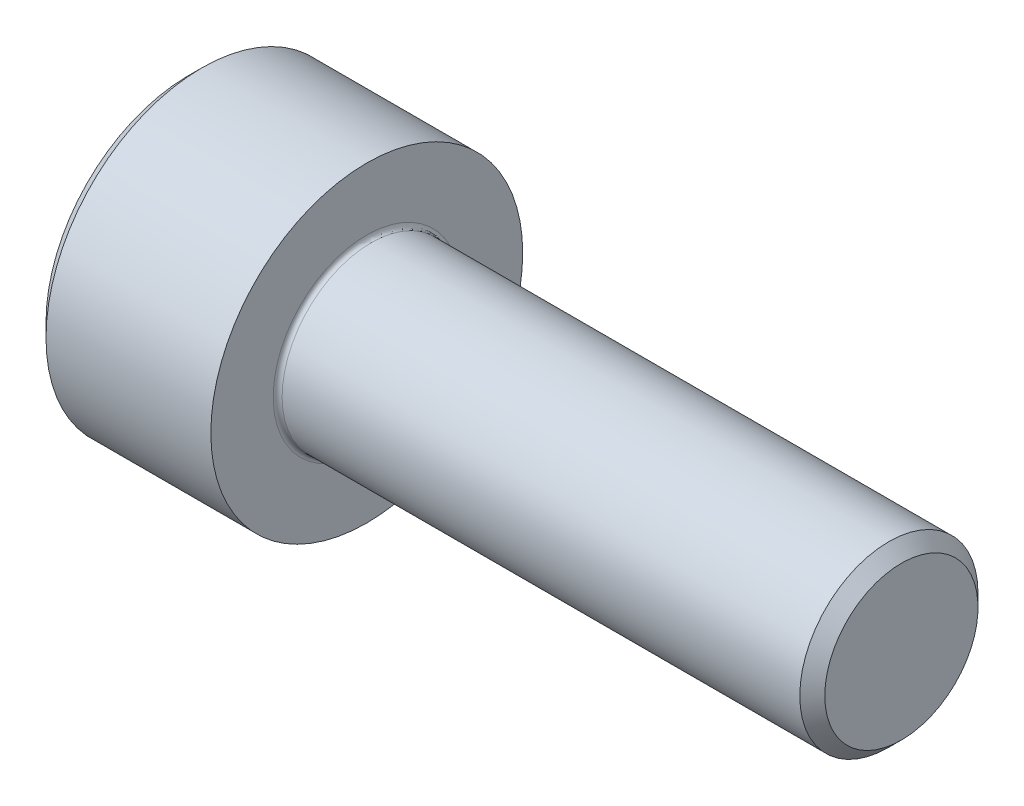
ISO-10303-21;
HEADER;
FILE_DESCRIPTION(('STEP AP214'),'2;1');
FILE_NAME('part.step','',(''),(''),'','','');
FILE_SCHEMA(('AUTOMOTIVE_DESIGN { 1 0 10303 214 1 1 1 1 }'));
ENDSEC;
DATA;
#1=APPLICATION_CONTEXT('core data for automotive mechanical design processes');
#2=APPLICATION_PROTOCOL_DEFINITION('international standard','automotive_design',2000,#1);
#3=PRODUCT_CONTEXT('',#1,'mechanical');
#4=PRODUCT('Part','Part','',(#3));
#5=PRODUCT_RELATED_PRODUCT_CATEGORY('part','',(#4));
#6=PRODUCT_DEFINITION_FORMATION('','',#4);
#7=PRODUCT_DEFINITION_CONTEXT('part definition',#1,'design');
#8=PRODUCT_DEFINITION('design','',#6,#7);
#9=PRODUCT_DEFINITION_SHAPE('','',#8);
#10=(LENGTH_UNIT() NAMED_UNIT(*) SI_UNIT(.MILLI.,.METRE.));
#11=(NAMED_UNIT(*) PLANE_ANGLE_UNIT() SI_UNIT($,.RADIAN.));
#12=(NAMED_UNIT(*) SI_UNIT($,.STERADIAN.) SOLID_ANGLE_UNIT());
#13=UNCERTAINTY_MEASURE_WITH_UNIT(LENGTH_MEASURE(1.E-05),#10,'distance_accuracy_value','');
#14=(GEOMETRIC_REPRESENTATION_CONTEXT(3) GLOBAL_UNCERTAINTY_ASSIGNED_CONTEXT((#13)) GLOBAL_UNIT_ASSIGNED_CONTEXT((#10,
#11,#12)) REPRESENTATION_CONTEXT('',''));
#15=CARTESIAN_POINT('',(0.,0.,0.));
#16=DIRECTION('',(0.,0.,1.));
#17=DIRECTION('',(1.,0.,0.));
#18=AXIS2_PLACEMENT_3D('',#15,#16,#17);
#19=CARTESIAN_POINT('',(0.,0.,0.));
#20=DIRECTION('',(-1.,0.,0.));
#21=DIRECTION('',(0.,0.,1.));
#22=AXIS2_PLACEMENT_3D('',#19,#20,#21);
#23=PLANE('',#22);
#24=CARTESIAN_POINT('',(0.,0.,0.));
#25=DIRECTION('',(-1.,0.,0.));
#26=DIRECTION('',(0.,0.,1.));
#27=AXIS2_PLACEMENT_3D('',#24,#25,#26);
#28=CIRCLE('',#27,1.778);
#29=CARTESIAN_POINT('',(0.,0.,1.77799999999999));
#30=VERTEX_POINT('',#29);
#31=EDGE_CURVE('E554',#30,#30,#28,.T.);
#32=ORIENTED_EDGE('',*,*,#31,.F.);
#33=EDGE_LOOP('',(#32));
#34=FACE_BOUND('',#33,.T.);
#35=CARTESIAN_POINT('',(0.,0.,0.));
#36=DIRECTION('',(-1.,0.,0.));
#37=DIRECTION('',(0.,0.,1.));
#38=AXIS2_PLACEMENT_3D('',#35,#36,#37);
#39=CIRCLE('',#38,3.19999999999999);
#40=CARTESIAN_POINT('',(0.,0.,3.19999999999999));
#41=VERTEX_POINT('',#40);
#42=EDGE_CURVE('E184',#41,#41,#39,.T.);
#43=ORIENTED_EDGE('',*,*,#42,.T.);
#44=EDGE_LOOP('',(#43));
#45=FACE_BOUND('',#44,.T.);
#46=ADVANCED_FACE('F44',(#34,#45),#23,.T.);
#47=CARTESIAN_POINT('',(16.,1.7195,0.));
#48=DIRECTION('',(1.,0.,0.));
#49=DIRECTION('',(0.,0.,-1.));
#50=AXIS2_PLACEMENT_3D('',#47,#48,#49);
#51=PLANE('',#50);
#52=CARTESIAN_POINT('',(16.,0.,0.));
#53=DIRECTION('',(-1.,0.,0.));
#54=DIRECTION('',(0.,0.,1.));
#55=AXIS2_PLACEMENT_3D('',#52,#53,#54);
#56=CIRCLE('',#55,1.7195);
#57=CARTESIAN_POINT('',(16.,0.,1.7195));
#58=VERTEX_POINT('',#57);
#59=EDGE_CURVE('E175',#58,#58,#56,.T.);
#60=ORIENTED_EDGE('',*,*,#59,.F.);
#61=EDGE_LOOP('',(#60));
#62=FACE_BOUND('',#61,.T.);
#63=ADVANCED_FACE('F198',(#62),#51,.T.);
#64=CARTESIAN_POINT('',(16.,0.,0.));
#65=DIRECTION('',(-1.,0.,0.));
#66=DIRECTION('',(0.,0.,1.));
#67=AXIS2_PLACEMENT_3D('',#64,#65,#66);
#68=CONICAL_SURFACE('',#67,1.7195,0.785398163397442);
#69=CARTESIAN_POINT('',(15.7195,0.,0.));
#70=DIRECTION('',(-1.,0.,0.));
#71=DIRECTION('',(0.,0.,1.));
#72=AXIS2_PLACEMENT_3D('',#69,#70,#71);
#73=CIRCLE('',#72,2.);
#74=CARTESIAN_POINT('',(15.7195,0.,2.));
#75=VERTEX_POINT('',#74);
#76=EDGE_CURVE('E172',#75,#75,#73,.T.);
#77=ORIENTED_EDGE('',*,*,#76,.F.);
#78=EDGE_LOOP('',(#77));
#79=FACE_BOUND('',#78,.T.);
#80=ORIENTED_EDGE('',*,*,#59,.T.);
#81=EDGE_LOOP('',(#80));
#82=FACE_BOUND('',#81,.T.);
#83=ADVANCED_FACE('F204',(#79,#82),#68,.T.);
#84=CARTESIAN_POINT('',(-31.75,0.,0.));
#85=DIRECTION('',(-1.,0.,0.));
#86=DIRECTION('',(0.,0.,1.));
#87=AXIS2_PLACEMENT_3D('',#84,#85,#86);
#88=CYLINDRICAL_SURFACE('',#87,2.);
#89=CARTESIAN_POINT('',(4.1,0.,0.));
#90=DIRECTION('',(1.,0.,0.));
#91=DIRECTION('',(0.,0.,-1.));
#92=AXIS2_PLACEMENT_3D('',#89,#90,#91);
#93=CIRCLE('',#92,2.);
#94=CARTESIAN_POINT('',(4.1,0.,-2.));
#95=VERTEX_POINT('',#94);
#96=EDGE_CURVE('E181',#95,#95,#93,.T.);
#97=ORIENTED_EDGE('',*,*,#96,.T.);
#98=EDGE_LOOP('',(#97));
#99=FACE_BOUND('',#98,.T.);
#100=ORIENTED_EDGE('',*,*,#76,.T.);
#101=EDGE_LOOP('',(#100));
#102=FACE_BOUND('',#101,.T.);
#103=ADVANCED_FACE('F217',(#99,#102),#88,.T.);
#104=CARTESIAN_POINT('',(4.,3.5,0.));
#105=DIRECTION('',(1.,0.,0.));
#106=DIRECTION('',(0.,0.,-1.));
#107=AXIS2_PLACEMENT_3D('',#104,#105,#106);
#108=PLANE('',#107);
#109=CARTESIAN_POINT('',(4.,0.,0.));
#110=DIRECTION('',(1.,0.,0.));
#111=DIRECTION('',(0.,0.,-1.));
#112=AXIS2_PLACEMENT_3D('',#109,#110,#111);
#113=CIRCLE('',#112,2.1);
#114=CARTESIAN_POINT('',(4.,0.,-2.1));
#115=VERTEX_POINT('',#114);
#116=EDGE_CURVE('E178',#115,#115,#113,.F.);
#117=ORIENTED_EDGE('',*,*,#116,.T.);
#118=EDGE_LOOP('',(#117));
#119=FACE_BOUND('',#118,.T.);
#120=CARTESIAN_POINT('',(4.,0.,0.));
#121=DIRECTION('',(-1.,0.,0.));
#122=DIRECTION('',(0.,0.,1.));
#123=AXIS2_PLACEMENT_3D('',#120,#121,#122);
#124=CIRCLE('',#123,3.5);
#125=CARTESIAN_POINT('',(4.,0.,3.5));
#126=VERTEX_POINT('',#125);
#127=EDGE_CURVE('E168',#126,#126,#124,.T.);
#128=ORIENTED_EDGE('',*,*,#127,.F.);
#129=EDGE_LOOP('',(#128));
#130=FACE_BOUND('',#129,.T.);
#131=ADVANCED_FACE('F214',(#119,#130),#108,.T.);
#132=CARTESIAN_POINT('',(-31.75,0.,0.));
#133=DIRECTION('',(-1.,0.,0.));
#134=DIRECTION('',(0.,0.,1.));
#135=AXIS2_PLACEMENT_3D('',#132,#133,#134);
#136=CYLINDRICAL_SURFACE('',#135,3.5);
#137=CARTESIAN_POINT('',(0.300000000000009,0.,0.));
#138=DIRECTION('',(-1.,0.,0.));
#139=DIRECTION('',(0.,0.,1.));
#140=AXIS2_PLACEMENT_3D('',#137,#138,#139);
#141=CIRCLE('',#140,3.5);
#142=CARTESIAN_POINT('',(0.300000000000009,0.,3.5));
#143=VERTEX_POINT('',#142);
#144=EDGE_CURVE('E59',#143,#143,#141,.F.);
#145=ORIENTED_EDGE('',*,*,#144,.T.);
#146=EDGE_LOOP('',(#145));
#147=FACE_BOUND('',#146,.T.);
#148=ORIENTED_EDGE('',*,*,#127,.T.);
#149=EDGE_LOOP('',(#148));
#150=FACE_BOUND('',#149,.T.);
#151=ADVANCED_FACE('F189',(#147,#150),#136,.T.);
#152=CARTESIAN_POINT('',(4.1,0.,0.));
#153=DIRECTION('',(1.,0.,0.));
#154=DIRECTION('',(0.,0.,-1.));
#155=AXIS2_PLACEMENT_3D('',#152,#153,#154);
#156=TOROIDAL_SURFACE('',#155,2.1,0.1);
#157=ORIENTED_EDGE('',*,*,#96,.F.);
#158=EDGE_LOOP('',(#157));
#159=FACE_BOUND('',#158,.T.);
#160=ORIENTED_EDGE('',*,*,#116,.F.);
#161=EDGE_LOOP('',(#160));
#162=FACE_BOUND('',#161,.T.);
#163=ADVANCED_FACE('F194',(#159,#162),#156,.F.);
#164=CARTESIAN_POINT('',(0.,0.,0.));
#165=DIRECTION('',(1.,0.,0.));
#166=DIRECTION('',(0.,0.,-1.));
#167=AXIS2_PLACEMENT_3D('',#164,#165,#166);
#168=CONICAL_SURFACE('',#167,3.19999999999999,0.785398163397449);
#169=ORIENTED_EDGE('',*,*,#144,.F.);
#170=EDGE_LOOP('',(#169));
#171=FACE_BOUND('',#170,.T.);
#172=ORIENTED_EDGE('',*,*,#42,.F.);
#173=EDGE_LOOP('',(#172));
#174=FACE_BOUND('',#173,.T.);
#175=ADVANCED_FACE('F47',(#171,#174),#168,.T.);
#176=CARTESIAN_POINT('',(1.02652877861915,0.,0.));
#177=DIRECTION('',(-1.,0.,0.));
#178=DIRECTION('',(0.,0.,1.));
#179=AXIS2_PLACEMENT_3D('',#176,#177,#178);
#180=CONICAL_SURFACE('',#179,0.,1.0471975511966);
#181=CARTESIAN_POINT('',(-0.84805707766872,2.87962087743916,1.5));
#182=CARTESIAN_POINT('',(-0.813557146020562,2.81223773569213,1.5));
#183=CARTESIAN_POINT('',(-0.779256228023989,2.74475210365327,1.5));
#184=CARTESIAN_POINT('',(-0.711147209277535,2.60953099121982,1.5));
#185=CARTESIAN_POINT('',(-0.677339118809463,2.5417955056494,1.5));
#186=CARTESIAN_POINT('',(-0.576684949780686,2.33792133487843,1.5));
#187=CARTESIAN_POINT('',(-0.510726442595574,2.20134280296096,1.5));
#188=CARTESIAN_POINT('',(-0.379064742221428,1.91947032885077,1.5));
#189=CARTESIAN_POINT('',(-0.313547399789196,1.77408809417681,1.5));
#190=CARTESIAN_POINT('',(-0.220126692276441,1.55398906211374,1.5));
#191=CARTESIAN_POINT('',(-0.189802664577908,1.48030382118325,1.5));
#192=CARTESIAN_POINT('',(-0.131278608526262,1.33209827587594,1.5));
#193=CARTESIAN_POINT('',(-0.103078367813924,1.25757805584766,1.5));
#194=CARTESIAN_POINT('',(-0.0447274413177184,1.09433773656075,1.5));
#195=CARTESIAN_POINT('',(-0.0151061608565583,1.00542551961867,1.5));
#196=CARTESIAN_POINT('',(0.0388588143368879,0.826031601344016,1.5));
#197=CARTESIAN_POINT('',(0.0632052763890816,0.735550750003298,1.5));
#198=CARTESIAN_POINT('',(0.104419163122362,0.554634229839851,1.5));
#199=CARTESIAN_POINT('',(0.121417973117149,0.464229377212352,1.5));
#200=CARTESIAN_POINT('',(0.146778460799096,0.282220704089601,1.5));
#201=CARTESIAN_POINT('',(0.155145034747594,0.190617593148729,1.5));
#202=CARTESIAN_POINT('',(0.162148638353524,0.00592656140734535,1.5));
#203=CARTESIAN_POINT('',(0.160668398516415,-0.0871660353999365,1.5));
#204=CARTESIAN_POINT('',(0.147922534265572,-0.272683144674958,1.5));
#205=CARTESIAN_POINT('',(0.136653113162767,-0.365107383897617,1.5));
#206=CARTESIAN_POINT('',(0.10551156372726,-0.55031775899198,1.5));
#207=CARTESIAN_POINT('',(0.0854740669819916,-0.643075047216172,1.5));
#208=CARTESIAN_POINT('',(0.0387855343766016,-0.826885725288181,1.5));
#209=CARTESIAN_POINT('',(0.0121329017456725,-0.917938698030896,1.5));
#210=CARTESIAN_POINT('',(-0.0438415544771441,-1.09173342143949,1.5));
#211=CARTESIAN_POINT('',(-0.0728166359570428,-1.17458902414324,1.5));
#212=CARTESIAN_POINT('',(-0.133843462256303,-1.33916745723375,1.5));
#213=CARTESIAN_POINT('',(-0.165895834879683,-1.42089005256515,1.5));
#214=CARTESIAN_POINT('',(-0.232316070067436,-1.58346776999662,1.5));
#215=CARTESIAN_POINT('',(-0.266686001675399,-1.66432204020092,1.5));
#216=CARTESIAN_POINT('',(-0.337152598035394,-1.82527558223557,1.5));
#217=CARTESIAN_POINT('',(-0.373249348106071,-1.90537481652657,1.5));
#218=CARTESIAN_POINT('',(-0.444784275310325,-2.06066864110438,1.5));
#219=CARTESIAN_POINT('',(-0.480153343813507,-2.13589518973498,1.5));
#220=CARTESIAN_POINT('',(-0.551823611227241,-2.28590465036236,1.5));
#221=CARTESIAN_POINT('',(-0.588124836884602,-2.36068754955334,1.5));
#222=CARTESIAN_POINT('',(-0.661360826728641,-2.50966923069355,1.5));
#223=CARTESIAN_POINT('',(-0.698293418846883,-2.58386908281746,1.5));
#224=CARTESIAN_POINT('',(-0.772758312676114,-2.73196000034828,1.5));
#225=CARTESIAN_POINT('',(-0.810290565948151,-2.80585109009396,1.5));
#226=CARTESIAN_POINT('',(-0.848057077668721,-2.87962087743916,1.5));
#227=B_SPLINE_CURVE_WITH_KNOTS('',3,(#181,#182,#183,#184,#185,#186,#187,#188,#189,#190,#191,
#192,#193,#194,#195,#196,#197,#198,#199,#200,#201,#202,#203,#204,#205,#206,#207,#208,#209,#210,
#211,#212,#213,#214,#215,#216,#217,#218,#219,#220,#221,#222,#223,#224,#225,#226),.UNSPECIFIED.,
.F.,.F.,(4,2,2,2,2,2,2,2,2,2,2,2,2,2,2,2,2,2,2,2,2,2,4),(0.,0.227105142586874,0.4542150164829,
0.909203755890935,1.38747963546457,1.62649782628385,1.86549208565626,2.14652394558189,
2.42740800924785,2.70303778637589,2.9785111383816,3.2572710333912,3.5361390924452,
3.82051003457641,4.10494968543632,4.36820035522284,4.63150484586581,4.89504760104963,
5.1586033908291,5.40797497930757,5.65735373113174,5.90600057813828,6.15462744068674),.UNSPECIFIED.);
#228=CARTESIAN_POINT('',(0.0265287786191456,0.86602540378444,1.5));
#229=VERTEX_POINT('',#228);
#230=CARTESIAN_POINT('',(0.0265287786191448,-0.866025403784438,1.5));
#231=VERTEX_POINT('',#230);
#232=EDGE_CURVE('E140',#229,#231,#227,.T.);
#233=ORIENTED_EDGE('',*,*,#232,.T.);
#234=CARTESIAN_POINT('',(0.0264621052862603,-1.73216627762272,-0.000199999999997832));
#235=CARTESIAN_POINT('',(0.0484459220655325,-1.69410775715987,0.06571929110255));
#236=CARTESIAN_POINT('',(0.068439889152888,-1.65572072040024,0.132207589122238));
#237=CARTESIAN_POINT('',(0.103340677650204,-1.5782818421891,0.266335660665073));
#238=CARTESIAN_POINT('',(0.118235150511543,-1.53922862406973,0.333977818646889));
#239=CARTESIAN_POINT('',(0.141422097524467,-1.4616062133209,0.468423777869846));
#240=CARTESIAN_POINT('',(0.149868867122895,-1.42304896848399,0.535206884927251));
#241=CARTESIAN_POINT('',(0.159955201322857,-1.34575291984755,0.669087568389884));
#242=CARTESIAN_POINT('',(0.161603115476818,-1.30701439726998,0.736184657704382));
#243=CARTESIAN_POINT('',(0.158187155781604,-1.23462040422031,0.861574731829199));
#244=CARTESIAN_POINT('',(0.153962019610728,-1.20095413349903,0.919886423219823));
#245=CARTESIAN_POINT('',(0.140567003402037,-1.13384094270175,1.03612987953879));
#246=CARTESIAN_POINT('',(0.13139254121886,-1.10039425500826,1.09406124196879));
#247=CARTESIAN_POINT('',(0.108455594879713,-1.03314252725216,1.21054465133915));
#248=CARTESIAN_POINT('',(0.0945958166732611,-0.999346005261151,1.26908194454669));
#249=CARTESIAN_POINT('',(0.063138994598051,-0.932257223377916,1.38528312338636));
#250=CARTESIAN_POINT('',(0.0455493489450914,-0.89896410301132,1.44294849940381));
#251=CARTESIAN_POINT('',(0.0264621052862559,-0.8659099337306,1.5002));
#252=B_SPLINE_CURVE_WITH_KNOTS('',3,(#234,#235,#236,#237,#238,#239,#240,#241,#242,#243,#244,
#245,#246,#247,#248,#249,#250,#251),.UNSPECIFIED.,.F.,.F.,(4,2,2,2,2,2,2,2,4),(0.,
0.237777822177384,0.47612742284192,0.708577067230591,0.940741159251582,1.14294352835891,
1.34533342091876,1.55221450553907,1.75868901573748),.UNSPECIFIED.);
#253=CARTESIAN_POINT('',(0.026528778619149,-1.73205080756888,0.));
#254=VERTEX_POINT('',#253);
#255=EDGE_CURVE('E542',#254,#231,#252,.T.);
#256=ORIENTED_EDGE('',*,*,#255,.F.);
#257=CARTESIAN_POINT('',(0.0264621052862652,-0.865909933730603,-1.5002));
#258=CARTESIAN_POINT('',(0.0484459220655372,-0.903968454193449,-1.43428070889745));
#259=CARTESIAN_POINT('',(0.0684398891528925,-0.942355490953075,-1.36779241087776));
#260=CARTESIAN_POINT('',(0.103340677650208,-1.01979436916422,-1.23366433933493));
#261=CARTESIAN_POINT('',(0.118235150511548,-1.05884758728358,-1.16602218135311));
#262=CARTESIAN_POINT('',(0.141422097524472,-1.13646999803242,-1.03157622213016));
#263=CARTESIAN_POINT('',(0.1498688671229,-1.17502724286933,-0.964793115072751));
#264=CARTESIAN_POINT('',(0.159955201322861,-1.25232329150577,-0.830912431610119));
#265=CARTESIAN_POINT('',(0.161603115476823,-1.29106181408334,-0.763815342295621));
#266=CARTESIAN_POINT('',(0.158187155781609,-1.36345580713301,-0.638425268170803));
#267=CARTESIAN_POINT('',(0.153962019610733,-1.39712207785428,-0.580113576780179));
#268=CARTESIAN_POINT('',(0.140567003402041,-1.46423526865157,-0.463870120461216));
#269=CARTESIAN_POINT('',(0.131392541218864,-1.49768195634506,-0.405938758031212));
#270=CARTESIAN_POINT('',(0.108455594879717,-1.56493368410116,-0.289455348660846));
#271=CARTESIAN_POINT('',(0.0945958166732656,-1.59873020609217,-0.230918055453306));
#272=CARTESIAN_POINT('',(0.0631389945980554,-1.6658189879754,-0.114716876613638));
#273=CARTESIAN_POINT('',(0.0455493489450958,-1.699112108342,-0.0570515005961871));
#274=CARTESIAN_POINT('',(0.0264621052862602,-1.73216627762272,0.00020000000000231));
#275=B_SPLINE_CURVE_WITH_KNOTS('',3,(#257,#258,#259,#260,#261,#262,#263,#264,#265,#266,#267,
#268,#269,#270,#271,#272,#273,#274),.UNSPECIFIED.,.F.,.F.,(4,2,2,2,2,2,2,2,4),(0.,
0.237777822177383,0.476127422841919,0.70857706723059,0.94074115925158,1.1429435283589,
1.34533342091876,1.55221450553907,1.75868901573748),.UNSPECIFIED.);
#276=CARTESIAN_POINT('',(0.0265287786191541,-0.866025403784441,-1.5));
#277=VERTEX_POINT('',#276);
#278=EDGE_CURVE('E537',#277,#254,#275,.T.);
#279=ORIENTED_EDGE('',*,*,#278,.F.);
#280=CARTESIAN_POINT('',(-0.848057077668713,-2.87962087743917,-1.5));
#281=CARTESIAN_POINT('',(-0.813557146020555,-2.81223773569213,-1.5));
#282=CARTESIAN_POINT('',(-0.779256228023982,-2.74475210365328,-1.5));
#283=CARTESIAN_POINT('',(-0.711147209277528,-2.60953099121983,-1.5));
#284=CARTESIAN_POINT('',(-0.677339118809455,-2.5417955056494,-1.5));
#285=CARTESIAN_POINT('',(-0.576684949780678,-2.33792133487843,-1.5));
#286=CARTESIAN_POINT('',(-0.510726442595566,-2.20134280296096,-1.5));
#287=CARTESIAN_POINT('',(-0.37906474222142,-1.91947032885077,-1.5));
#288=CARTESIAN_POINT('',(-0.313547399789189,-1.77408809417681,-1.5));
#289=CARTESIAN_POINT('',(-0.220126692276433,-1.55398906211374,-1.5));
#290=CARTESIAN_POINT('',(-0.189802664577899,-1.48030382118325,-1.5));
#291=CARTESIAN_POINT('',(-0.131278608526253,-1.33209827587594,-1.5));
#292=CARTESIAN_POINT('',(-0.103078367813916,-1.25757805584766,-1.5));
#293=CARTESIAN_POINT('',(-0.0447274413177097,-1.09433773656075,-1.5));
#294=CARTESIAN_POINT('',(-0.0151061608565495,-1.00542551961867,-1.5));
#295=CARTESIAN_POINT('',(0.0388588143368968,-0.826031601344016,-1.5));
#296=CARTESIAN_POINT('',(0.0632052763890904,-0.735550750003299,-1.5));
#297=CARTESIAN_POINT('',(0.10441916312237,-0.554634229839851,-1.5));
#298=CARTESIAN_POINT('',(0.121417973117158,-0.464229377212353,-1.5));
#299=CARTESIAN_POINT('',(0.146778460799105,-0.282220704089603,-1.5));
#300=CARTESIAN_POINT('',(0.155145034747604,-0.190617593148731,-1.5));
#301=CARTESIAN_POINT('',(0.162148638353534,-0.00592656140734728,-1.5));
#302=CARTESIAN_POINT('',(0.160668398516425,0.0871660353999344,-1.5));
#303=CARTESIAN_POINT('',(0.147922534265581,0.272683144674955,-1.5));
#304=CARTESIAN_POINT('',(0.136653113162777,0.365107383897615,-1.5));
#305=CARTESIAN_POINT('',(0.10551156372727,0.550317758991978,-1.5));
#306=CARTESIAN_POINT('',(0.0854740669820012,0.64307504721617,-1.5));
#307=CARTESIAN_POINT('',(0.0387855343766114,0.826885725288178,-1.5));
#308=CARTESIAN_POINT('',(0.0121329017456825,0.917938698030893,-1.5));
#309=CARTESIAN_POINT('',(-0.043841554477134,1.09173342143948,-1.5));
#310=CARTESIAN_POINT('',(-0.0728166359570329,1.17458902414324,-1.5));
#311=CARTESIAN_POINT('',(-0.133843462256294,1.33916745723375,-1.5));
#312=CARTESIAN_POINT('',(-0.165895834879673,1.42089005256515,-1.5));
#313=CARTESIAN_POINT('',(-0.232316070067426,1.58346776999661,-1.5));
#314=CARTESIAN_POINT('',(-0.266686001675389,1.66432204020091,-1.5));
#315=CARTESIAN_POINT('',(-0.337152598035385,1.82527558223557,-1.5));
#316=CARTESIAN_POINT('',(-0.373249348106062,1.90537481652657,-1.5));
#317=CARTESIAN_POINT('',(-0.444784275310316,2.06066864110437,-1.5));
#318=CARTESIAN_POINT('',(-0.480153343813499,2.13589518973498,-1.5));
#319=CARTESIAN_POINT('',(-0.551823611227233,2.28590465036236,-1.5));
#320=CARTESIAN_POINT('',(-0.588124836884594,2.36068754955334,-1.5));
#321=CARTESIAN_POINT('',(-0.661360826728633,2.50966923069355,-1.5));
#322=CARTESIAN_POINT('',(-0.698293418846875,2.58386908281746,-1.5));
#323=CARTESIAN_POINT('',(-0.772758312676106,2.73196000034828,-1.5));
#324=CARTESIAN_POINT('',(-0.810290565948143,2.80585109009396,-1.5));
#325=CARTESIAN_POINT('',(-0.848057077668713,2.87962087743916,-1.5));
#326=B_SPLINE_CURVE_WITH_KNOTS('',3,(#280,#281,#282,#283,#284,#285,#286,#287,#288,#289,#290,
#291,#292,#293,#294,#295,#296,#297,#298,#299,#300,#301,#302,#303,#304,#305,#306,#307,#308,#309,
#310,#311,#312,#313,#314,#315,#316,#317,#318,#319,#320,#321,#322,#323,#324,#325),.UNSPECIFIED.,
.F.,.F.,(4,2,2,2,2,2,2,2,2,2,2,2,2,2,2,2,2,2,2,2,2,2,4),(0.,0.227105142586873,0.454215016482901,
0.909203755890936,1.38747963546457,1.62649782628385,1.86549208565627,2.1465239455819,
2.42740800924785,2.70303778637589,2.9785111383816,3.2572710333912,3.5361390924452,
3.82051003457641,4.10494968543631,4.36820035522284,4.63150484586581,4.89504760104963,
5.15860339082911,5.40797497930758,5.65735373113174,5.90600057813829,6.15462744068674),.UNSPECIFIED.);
#327=CARTESIAN_POINT('',(0.0265287786191547,0.866025403784437,-1.5));
#328=VERTEX_POINT('',#327);
#329=EDGE_CURVE('E65',#277,#328,#326,.T.);
#330=ORIENTED_EDGE('',*,*,#329,.T.);
#331=CARTESIAN_POINT('',(0.0264621052862658,0.865909933730599,-1.5002));
#332=CARTESIAN_POINT('',(0.0484459220655379,0.903968454193444,-1.43428070889745));
#333=CARTESIAN_POINT('',(0.0684398891528932,0.942355490953071,-1.36779241087777));
#334=CARTESIAN_POINT('',(0.103340677650209,1.01979436916421,-1.23366433933493));
#335=CARTESIAN_POINT('',(0.118235150511549,1.05884758728358,-1.16602218135312));
#336=CARTESIAN_POINT('',(0.141422097524472,1.13646999803241,-1.03157622213016));
#337=CARTESIAN_POINT('',(0.149868867122901,1.17502724286933,-0.964793115072754));
#338=CARTESIAN_POINT('',(0.159955201322862,1.25232329150577,-0.830912431610121));
#339=CARTESIAN_POINT('',(0.161603115476824,1.29106181408333,-0.763815342295623));
#340=CARTESIAN_POINT('',(0.15818715578161,1.363455807133,-0.638425268170807));
#341=CARTESIAN_POINT('',(0.153962019610734,1.39712207785428,-0.580113576780183));
#342=CARTESIAN_POINT('',(0.140567003402042,1.46423526865157,-0.463870120461219));
#343=CARTESIAN_POINT('',(0.131392541218865,1.49768195634505,-0.405938758031216));
#344=CARTESIAN_POINT('',(0.108455594879718,1.56493368410116,-0.28945534866085));
#345=CARTESIAN_POINT('',(0.0945958166732664,1.59873020609216,-0.23091805545331));
#346=CARTESIAN_POINT('',(0.0631389945980561,1.6658189879754,-0.114716876613642));
#347=CARTESIAN_POINT('',(0.0455493489450966,1.699112108342,-0.057051500596191));
#348=CARTESIAN_POINT('',(0.026462105286261,1.73216627762272,0.000199999999998489));
#349=B_SPLINE_CURVE_WITH_KNOTS('',3,(#331,#332,#333,#334,#335,#336,#337,#338,#339,#340,#341,
#342,#343,#344,#345,#346,#347,#348),.UNSPECIFIED.,.F.,.F.,(4,2,2,2,2,2,2,2,4),(0.,
0.237777822177383,0.476127422841918,0.708577067230589,0.940741159251579,1.1429435283589,
1.34533342091875,1.55221450553907,1.75868901573748),.UNSPECIFIED.);
#350=CARTESIAN_POINT('',(0.0265287786191498,1.73205080756888,0.));
#351=VERTEX_POINT('',#350);
#352=EDGE_CURVE('E11',#328,#351,#349,.T.);
#353=ORIENTED_EDGE('',*,*,#352,.T.);
#354=CARTESIAN_POINT('',(0.0264621052862568,0.865909933730602,1.5002));
#355=CARTESIAN_POINT('',(0.0484459220655294,0.903968454193447,1.43428070889745));
#356=CARTESIAN_POINT('',(0.0684398891528852,0.942355490953074,1.36779241087776));
#357=CARTESIAN_POINT('',(0.103340677650202,1.01979436916421,1.23366433933493));
#358=CARTESIAN_POINT('',(0.118235150511542,1.05884758728358,1.16602218135311));
#359=CARTESIAN_POINT('',(0.141422097524466,1.13646999803242,1.03157622213016));
#360=CARTESIAN_POINT('',(0.149868867122895,1.17502724286933,0.96479311507275));
#361=CARTESIAN_POINT('',(0.159955201322857,1.25232329150577,0.830912431610117));
#362=CARTESIAN_POINT('',(0.161603115476819,1.29106181408334,0.763815342295619));
#363=CARTESIAN_POINT('',(0.158187155781606,1.36345580713301,0.638425268170802));
#364=CARTESIAN_POINT('',(0.15396201961073,1.39712207785428,0.580113576780178));
#365=CARTESIAN_POINT('',(0.140567003402039,1.46423526865157,0.463870120461215));
#366=CARTESIAN_POINT('',(0.131392541218862,1.49768195634505,0.405938758031212));
#367=CARTESIAN_POINT('',(0.108455594879716,1.56493368410116,0.289455348660846));
#368=CARTESIAN_POINT('',(0.0945958166732649,1.59873020609217,0.230918055453306));
#369=CARTESIAN_POINT('',(0.0631389945980554,1.6658189879754,0.114716876613638));
#370=CARTESIAN_POINT('',(0.0455493489450962,1.699112108342,0.0570515005961877));
#371=CARTESIAN_POINT('',(0.026462105286261,1.73216627762272,-0.000200000000001534));
#372=B_SPLINE_CURVE_WITH_KNOTS('',3,(#354,#355,#356,#357,#358,#359,#360,#361,#362,#363,#364,
#365,#366,#367,#368,#369,#370,#371),.UNSPECIFIED.,.F.,.F.,(4,2,2,2,2,2,2,2,4),(0.,
0.237777822177384,0.47612742284192,0.708577067230592,0.940741159251583,1.14294352835891,
1.34533342091876,1.55221450553907,1.75868901573748),.UNSPECIFIED.);
#373=EDGE_CURVE('E124',#229,#351,#372,.T.);
#374=ORIENTED_EDGE('',*,*,#373,.F.);
#375=EDGE_LOOP('',(#233,#256,#279,#330,#353,#374));
#376=FACE_BOUND('',#375,.T.);
#377=ORIENTED_EDGE('',*,*,#31,.T.);
#378=EDGE_LOOP('',(#377));
#379=FACE_BOUND('',#378,.T.);
#380=ADVANCED_FACE('F122',(#376,#379),#180,.F.);
#381=CARTESIAN_POINT('',(1.3,0.,0.));
#382=DIRECTION('',(-1.,0.,0.));
#383=DIRECTION('',(0.,0.,1.));
#384=AXIS2_PLACEMENT_3D('',#381,#382,#383);
#385=CONICAL_SURFACE('',#384,1.5,1.04719755119659);
#386=CARTESIAN_POINT('',(2.16602540378445,0.,0.));
#387=VERTEX_POINT('',#386);
#388=VERTEX_LOOP('',#387);
#389=FACE_BOUND('',#388,.T.);
#390=CARTESIAN_POINT('',(1.3,0.,0.));
#391=DIRECTION('',(-1.,0.,0.));
#392=DIRECTION('',(0.,0.,1.));
#393=AXIS2_PLACEMENT_3D('',#390,#391,#392);
#394=CIRCLE('',#393,1.5);
#395=CARTESIAN_POINT('',(1.3,0.,1.5));
#396=VERTEX_POINT('',#395);
#397=CARTESIAN_POINT('',(1.3,1.29903810567666,0.749999999999999));
#398=VERTEX_POINT('',#397);
#399=EDGE_CURVE('E165',#396,#398,#394,.T.);
#400=ORIENTED_EDGE('',*,*,#399,.T.);
#401=CARTESIAN_POINT('',(1.3,1.29903810567666,-0.750000000000002));
#402=VERTEX_POINT('',#401);
#403=EDGE_CURVE('E169',#398,#402,#394,.T.);
#404=ORIENTED_EDGE('',*,*,#403,.T.);
#405=CARTESIAN_POINT('',(1.3,0.,-1.5));
#406=VERTEX_POINT('',#405);
#407=EDGE_CURVE('E582',#402,#406,#394,.T.);
#408=ORIENTED_EDGE('',*,*,#407,.T.);
#409=CARTESIAN_POINT('',(1.3,-1.29903810567666,-0.749999999999999));
#410=VERTEX_POINT('',#409);
#411=EDGE_CURVE('E577',#406,#410,#394,.T.);
#412=ORIENTED_EDGE('',*,*,#411,.T.);
#413=CARTESIAN_POINT('',(1.3,-1.29903810567666,0.750000000000002));
#414=VERTEX_POINT('',#413);
#415=EDGE_CURVE('E584',#410,#414,#394,.T.);
#416=ORIENTED_EDGE('',*,*,#415,.T.);
#417=EDGE_CURVE('E164',#414,#396,#394,.T.);
#418=ORIENTED_EDGE('',*,*,#417,.T.);
#419=EDGE_LOOP('',(#400,#404,#408,#412,#416,#418));
#420=FACE_BOUND('',#419,.T.);
#421=ADVANCED_FACE('F210',(#389,#420),#385,.F.);
#422=CARTESIAN_POINT('',(1.3,1.73205080756888,0.));
#423=DIRECTION('',(1.,0.,0.));
#424=DIRECTION('',(0.,0.,-1.));
#425=AXIS2_PLACEMENT_3D('',#422,#423,#424);
#426=PLANE('',#425);
#427=DIRECTION('',(0.,1.,0.));
#428=VECTOR('',#427,1.);
#429=CARTESIAN_POINT('',(1.3,-0.866025403784438,1.5));
#430=LINE('',#429,#428);
#431=CARTESIAN_POINT('',(1.3,0.86602540378444,1.5));
#432=VERTEX_POINT('',#431);
#433=EDGE_CURVE('E570',#396,#432,#430,.T.);
#434=ORIENTED_EDGE('',*,*,#433,.T.);
#435=DIRECTION('',(0.,-0.5,0.866025403784439));
#436=VECTOR('',#435,1.);
#437=CARTESIAN_POINT('',(1.3,1.73205080756888,0.));
#438=LINE('',#437,#436);
#439=EDGE_CURVE('E139',#398,#432,#438,.T.);
#440=ORIENTED_EDGE('',*,*,#439,.F.);
#441=ORIENTED_EDGE('',*,*,#399,.F.);
#442=EDGE_LOOP('',(#434,#440,#441));
#443=FACE_BOUND('',#442,.T.);
#444=ADVANCED_FACE('F254',(#443),#426,.F.);
#445=DIRECTION('',(0.,-0.500000000000001,-0.866025403784438));
#446=VECTOR('',#445,1.);
#447=CARTESIAN_POINT('',(1.3,-0.866025403784438,1.5));
#448=LINE('',#447,#446);
#449=CARTESIAN_POINT('',(1.3,-0.866025403784438,1.5));
#450=VERTEX_POINT('',#449);
#451=EDGE_CURVE('E564',#450,#414,#448,.T.);
#452=ORIENTED_EDGE('',*,*,#451,.F.);
#453=EDGE_CURVE('E566',#450,#396,#430,.T.);
#454=ORIENTED_EDGE('',*,*,#453,.T.);
#455=ORIENTED_EDGE('',*,*,#417,.F.);
#456=EDGE_LOOP('',(#452,#454,#455));
#457=FACE_BOUND('',#456,.T.);
#458=ADVANCED_FACE('F261',(#457),#426,.F.);
#459=DIRECTION('',(0.,0.499999999999999,-0.866025403784439));
#460=VECTOR('',#459,1.);
#461=CARTESIAN_POINT('',(1.3,-1.73205080756888,0.));
#462=LINE('',#461,#460);
#463=CARTESIAN_POINT('',(1.3,-1.73205080756888,0.));
#464=VERTEX_POINT('',#463);
#465=EDGE_CURVE('E572',#464,#410,#462,.T.);
#466=ORIENTED_EDGE('',*,*,#465,.F.);
#467=EDGE_CURVE('E562',#414,#464,#448,.T.);
#468=ORIENTED_EDGE('',*,*,#467,.F.);
#469=ORIENTED_EDGE('',*,*,#415,.F.);
#470=EDGE_LOOP('',(#466,#468,#469));
#471=FACE_BOUND('',#470,.T.);
#472=ADVANCED_FACE('F270',(#471),#426,.F.);
#473=DIRECTION('',(0.,-1.,0.));
#474=VECTOR('',#473,1.);
#475=CARTESIAN_POINT('',(1.3,0.866025403784437,-1.5));
#476=LINE('',#475,#474);
#477=CARTESIAN_POINT('',(1.3,-0.866025403784441,-1.5));
#478=VERTEX_POINT('',#477);
#479=EDGE_CURVE('E573',#406,#478,#476,.T.);
#480=ORIENTED_EDGE('',*,*,#479,.T.);
#481=EDGE_CURVE('E568',#410,#478,#462,.T.);
#482=ORIENTED_EDGE('',*,*,#481,.F.);
#483=ORIENTED_EDGE('',*,*,#411,.F.);
#484=EDGE_LOOP('',(#480,#482,#483));
#485=FACE_BOUND('',#484,.T.);
#486=ADVANCED_FACE('F277',(#485),#426,.F.);
#487=CARTESIAN_POINT('',(1.3,1.73205080756888,0.));
#488=VERTEX_POINT('',#487);
#489=EDGE_CURVE('E522',#488,#398,#438,.T.);
#490=ORIENTED_EDGE('',*,*,#489,.F.);
#491=DIRECTION('',(0.,-0.500000000000001,-0.866025403784438));
#492=VECTOR('',#491,1.);
#493=CARTESIAN_POINT('',(1.3,1.73205080756888,0.));
#494=LINE('',#493,#492);
#495=EDGE_CURVE('E146',#488,#402,#494,.T.);
#496=ORIENTED_EDGE('',*,*,#495,.T.);
#497=ORIENTED_EDGE('',*,*,#403,.F.);
#498=EDGE_LOOP('',(#490,#496,#497));
#499=FACE_BOUND('',#498,.T.);
#500=ADVANCED_FACE('F264',(#499),#426,.F.);
#501=CARTESIAN_POINT('',(1.3,0.866025403784437,-1.5));
#502=VERTEX_POINT('',#501);
#503=EDGE_CURVE('E151',#402,#502,#494,.T.);
#504=ORIENTED_EDGE('',*,*,#503,.T.);
#505=EDGE_CURVE('E73',#502,#406,#476,.T.);
#506=ORIENTED_EDGE('',*,*,#505,.T.);
#507=ORIENTED_EDGE('',*,*,#407,.F.);
#508=EDGE_LOOP('',(#504,#506,#507));
#509=FACE_BOUND('',#508,.T.);
#510=ADVANCED_FACE('F285',(#509),#426,.F.);
#511=CARTESIAN_POINT('',(1.3,1.73205080756888,0.));
#512=DIRECTION('',(0.,0.866025403784438,-0.500000000000001));
#513=DIRECTION('',(0.,0.500000000000001,0.866025403784438));
#514=AXIS2_PLACEMENT_3D('',#511,#512,#513);
#515=PLANE('',#514);
#516=ORIENTED_EDGE('',*,*,#352,.F.);
#517=DIRECTION('',(-1.,0.,0.));
#518=VECTOR('',#517,1.);
#519=CARTESIAN_POINT('',(1.3,0.866025403784437,-1.5));
#520=LINE('',#519,#518);
#521=EDGE_CURVE('E147',#502,#328,#520,.T.);
#522=ORIENTED_EDGE('',*,*,#521,.F.);
#523=ORIENTED_EDGE('',*,*,#503,.F.);
#524=ORIENTED_EDGE('',*,*,#495,.F.);
#525=DIRECTION('',(-1.,0.,0.));
#526=VECTOR('',#525,1.);
#527=CARTESIAN_POINT('',(1.3,1.73205080756888,0.));
#528=LINE('',#527,#526);
#529=EDGE_CURVE('E134',#488,#351,#528,.T.);
#530=ORIENTED_EDGE('',*,*,#529,.T.);
#531=EDGE_LOOP('',(#516,#522,#523,#524,#530));
#532=FACE_BOUND('',#531,.T.);
#533=ADVANCED_FACE('F143',(#532),#515,.F.);
#534=CARTESIAN_POINT('',(1.3,0.866025403784437,-1.5));
#535=DIRECTION('',(0.,0.,-1.));
#536=DIRECTION('',(0.,1.,0.));
#537=AXIS2_PLACEMENT_3D('',#534,#535,#536);
#538=PLANE('',#537);
#539=ORIENTED_EDGE('',*,*,#329,.F.);
#540=DIRECTION('',(-1.,0.,0.));
#541=VECTOR('',#540,1.);
#542=CARTESIAN_POINT('',(1.3,-0.866025403784441,-1.5));
#543=LINE('',#542,#541);
#544=EDGE_CURVE('E149',#478,#277,#543,.T.);
#545=ORIENTED_EDGE('',*,*,#544,.F.);
#546=ORIENTED_EDGE('',*,*,#479,.F.);
#547=ORIENTED_EDGE('',*,*,#505,.F.);
#548=ORIENTED_EDGE('',*,*,#521,.T.);
#549=EDGE_LOOP('',(#539,#545,#546,#547,#548));
#550=FACE_BOUND('',#549,.T.);
#551=ADVANCED_FACE('F302',(#550),#538,.F.);
#552=CARTESIAN_POINT('',(1.3,-1.73205080756888,0.));
#553=DIRECTION('',(0.,0.866025403784439,0.499999999999999));
#554=DIRECTION('',(0.,-0.499999999999999,0.866025403784439));
#555=AXIS2_PLACEMENT_3D('',#552,#553,#554);
#556=PLANE('',#555);
#557=ORIENTED_EDGE('',*,*,#544,.T.);
#558=ORIENTED_EDGE('',*,*,#278,.T.);
#559=DIRECTION('',(-1.,0.,0.));
#560=VECTOR('',#559,1.);
#561=CARTESIAN_POINT('',(1.3,-1.73205080756888,0.));
#562=LINE('',#561,#560);
#563=EDGE_CURVE('E157',#464,#254,#562,.T.);
#564=ORIENTED_EDGE('',*,*,#563,.F.);
#565=ORIENTED_EDGE('',*,*,#465,.T.);
#566=ORIENTED_EDGE('',*,*,#481,.T.);
#567=EDGE_LOOP('',(#557,#558,#564,#565,#566));
#568=FACE_BOUND('',#567,.T.);
#569=ADVANCED_FACE('F308',(#568),#556,.T.);
#570=CARTESIAN_POINT('',(1.3,-0.866025403784438,1.5));
#571=DIRECTION('',(0.,0.866025403784438,-0.500000000000001));
#572=DIRECTION('',(0.,0.500000000000001,0.866025403784438));
#573=AXIS2_PLACEMENT_3D('',#570,#571,#572);
#574=PLANE('',#573);
#575=ORIENTED_EDGE('',*,*,#563,.T.);
#576=ORIENTED_EDGE('',*,*,#255,.T.);
#577=DIRECTION('',(-1.,0.,0.));
#578=VECTOR('',#577,1.);
#579=CARTESIAN_POINT('',(1.3,-0.866025403784438,1.5));
#580=LINE('',#579,#578);
#581=EDGE_CURVE('E160',#450,#231,#580,.T.);
#582=ORIENTED_EDGE('',*,*,#581,.F.);
#583=ORIENTED_EDGE('',*,*,#451,.T.);
#584=ORIENTED_EDGE('',*,*,#467,.T.);
#585=EDGE_LOOP('',(#575,#576,#582,#583,#584));
#586=FACE_BOUND('',#585,.T.);
#587=ADVANCED_FACE('F316',(#586),#574,.T.);
#588=CARTESIAN_POINT('',(1.3,-0.866025403784438,1.5));
#589=DIRECTION('',(0.,0.,1.));
#590=DIRECTION('',(0.,-1.,0.));
#591=AXIS2_PLACEMENT_3D('',#588,#589,#590);
#592=PLANE('',#591);
#593=ORIENTED_EDGE('',*,*,#232,.F.);
#594=DIRECTION('',(-1.,0.,0.));
#595=VECTOR('',#594,1.);
#596=CARTESIAN_POINT('',(1.3,0.86602540378444,1.5));
#597=LINE('',#596,#595);
#598=EDGE_CURVE('E138',#432,#229,#597,.T.);
#599=ORIENTED_EDGE('',*,*,#598,.F.);
#600=ORIENTED_EDGE('',*,*,#433,.F.);
#601=ORIENTED_EDGE('',*,*,#453,.F.);
#602=ORIENTED_EDGE('',*,*,#581,.T.);
#603=EDGE_LOOP('',(#593,#599,#600,#601,#602));
#604=FACE_BOUND('',#603,.T.);
#605=ADVANCED_FACE('F324',(#604),#592,.F.);
#606=CARTESIAN_POINT('',(1.3,1.73205080756888,0.));
#607=DIRECTION('',(0.,-0.866025403784439,-0.5));
#608=DIRECTION('',(0.,0.5,-0.866025403784439));
#609=AXIS2_PLACEMENT_3D('',#606,#607,#608);
#610=PLANE('',#609);
#611=ORIENTED_EDGE('',*,*,#598,.T.);
#612=ORIENTED_EDGE('',*,*,#373,.T.);
#613=ORIENTED_EDGE('',*,*,#529,.F.);
#614=ORIENTED_EDGE('',*,*,#489,.T.);
#615=ORIENTED_EDGE('',*,*,#439,.T.);
#616=EDGE_LOOP('',(#611,#612,#613,#614,#615));
#617=FACE_BOUND('',#616,.T.);
#618=ADVANCED_FACE('F132',(#617),#610,.T.);
#619=CLOSED_SHELL('',(#46,#63,#83,#103,#131,#151,#163,#175,#380,#421,#444,#458,#472,#486,#500,
#510,#533,#551,#569,#587,#605,#618));
#620=MANIFOLD_SOLID_BREP('B2',#619);
#621=ADVANCED_BREP_SHAPE_REPRESENTATION('',(#18,#620),#14);
#622=SHAPE_DEFINITION_REPRESENTATION(#9,#621);
ENDSEC;
END-ISO-10303-21;
